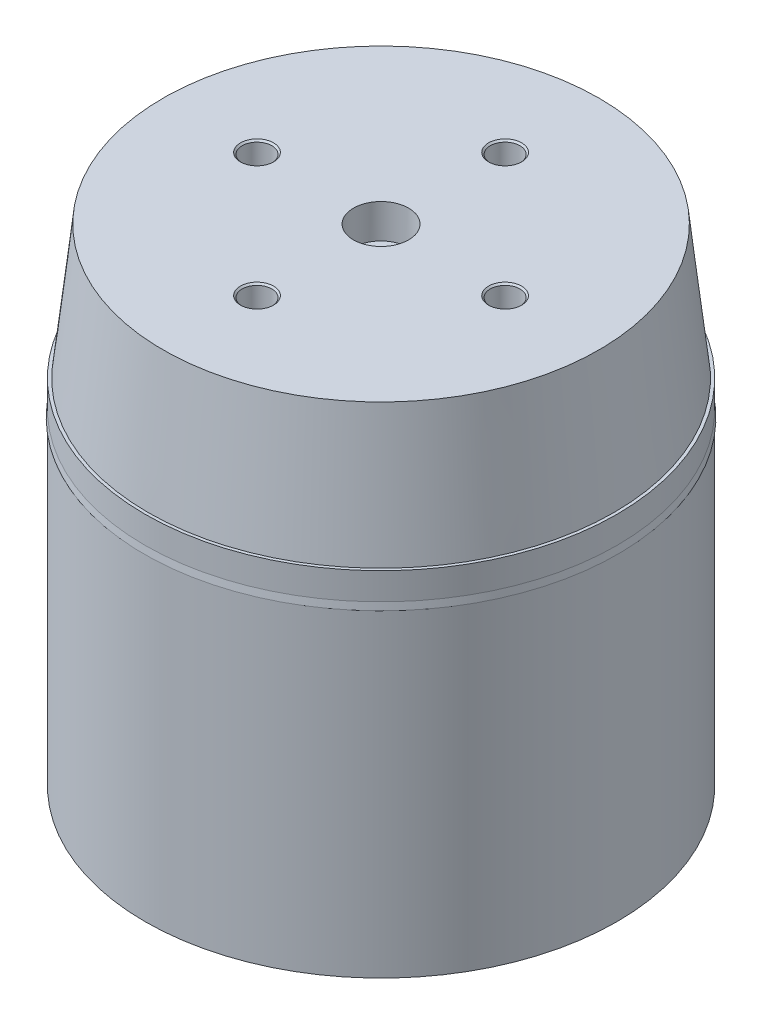
ISO-10303-21;
HEADER;
FILE_DESCRIPTION(('STEP AP214'),'2;1');
FILE_NAME('part.step','',(''),(''),'','','');
FILE_SCHEMA(('AUTOMOTIVE_DESIGN { 1 0 10303 214 1 1 1 1 }'));
ENDSEC;
DATA;
#1=APPLICATION_CONTEXT('core data for automotive mechanical design processes');
#2=APPLICATION_PROTOCOL_DEFINITION('international standard','automotive_design',2000,#1);
#3=PRODUCT_CONTEXT('',#1,'mechanical');
#4=PRODUCT('Part','Part','',(#3));
#5=PRODUCT_RELATED_PRODUCT_CATEGORY('part','',(#4));
#6=PRODUCT_DEFINITION_FORMATION('','',#4);
#7=PRODUCT_DEFINITION_CONTEXT('part definition',#1,'design');
#8=PRODUCT_DEFINITION('design','',#6,#7);
#9=PRODUCT_DEFINITION_SHAPE('','',#8);
#10=(LENGTH_UNIT() NAMED_UNIT(*) SI_UNIT(.MILLI.,.METRE.));
#11=(NAMED_UNIT(*) PLANE_ANGLE_UNIT() SI_UNIT($,.RADIAN.));
#12=(NAMED_UNIT(*) SI_UNIT($,.STERADIAN.) SOLID_ANGLE_UNIT());
#13=UNCERTAINTY_MEASURE_WITH_UNIT(LENGTH_MEASURE(1.E-05),#10,'distance_accuracy_value','');
#14=(GEOMETRIC_REPRESENTATION_CONTEXT(3) GLOBAL_UNCERTAINTY_ASSIGNED_CONTEXT((#13)) GLOBAL_UNIT_ASSIGNED_CONTEXT((#10,
#11,#12)) REPRESENTATION_CONTEXT('',''));
#15=CARTESIAN_POINT('',(0.,0.,0.));
#16=DIRECTION('',(0.,0.,1.));
#17=DIRECTION('',(1.,0.,0.));
#18=AXIS2_PLACEMENT_3D('',#15,#16,#17);
#19=CARTESIAN_POINT('',(0.,32.,0.));
#20=DIRECTION('',(0.,-1.,0.));
#21=DIRECTION('',(0.,0.,-1.));
#22=AXIS2_PLACEMENT_3D('',#19,#20,#21);
#23=CYLINDRICAL_SURFACE('',#22,21.4);
#24=CARTESIAN_POINT('',(0.,0.,0.));
#25=DIRECTION('',(0.,1.,0.));
#26=DIRECTION('',(0.,0.,1.));
#27=AXIS2_PLACEMENT_3D('',#24,#25,#26);
#28=CIRCLE('',#27,21.4);
#29=CARTESIAN_POINT('',(0.,0.,21.4));
#30=VERTEX_POINT('',#29);
#31=EDGE_CURVE('E60',#30,#30,#28,.T.);
#32=ORIENTED_EDGE('',*,*,#31,.T.);
#33=EDGE_LOOP('',(#32));
#34=FACE_BOUND('',#33,.T.);
#35=CARTESIAN_POINT('',(0.,28.9,0.));
#36=DIRECTION('',(0.,1.,0.));
#37=DIRECTION('',(0.,0.,1.));
#38=AXIS2_PLACEMENT_3D('',#35,#36,#37);
#39=CIRCLE('',#38,21.4);
#40=CARTESIAN_POINT('',(0.,28.9,21.4));
#41=VERTEX_POINT('',#40);
#42=EDGE_CURVE('E10',#41,#41,#39,.T.);
#43=ORIENTED_EDGE('',*,*,#42,.F.);
#44=EDGE_LOOP('',(#43));
#45=FACE_BOUND('',#44,.T.);
#46=ADVANCED_FACE('F33',(#34,#45),#23,.T.);
#47=CARTESIAN_POINT('',(0.,32.,0.));
#48=DIRECTION('',(0.,-1.,0.));
#49=DIRECTION('',(0.,0.,-1.));
#50=AXIS2_PLACEMENT_3D('',#47,#48,#49);
#51=CYLINDRICAL_SURFACE('',#50,18.);
#52=CARTESIAN_POINT('',(0.,0.,0.));
#53=DIRECTION('',(0.,1.,0.));
#54=DIRECTION('',(0.,0.,1.));
#55=AXIS2_PLACEMENT_3D('',#52,#53,#54);
#56=CIRCLE('',#55,18.);
#57=CARTESIAN_POINT('',(0.,0.,18.));
#58=VERTEX_POINT('',#57);
#59=EDGE_CURVE('E56',#58,#58,#56,.T.);
#60=ORIENTED_EDGE('',*,*,#59,.F.);
#61=EDGE_LOOP('',(#60));
#62=FACE_BOUND('',#61,.T.);
#63=CARTESIAN_POINT('',(0.,28.9,0.));
#64=DIRECTION('',(0.,1.,0.));
#65=DIRECTION('',(0.,0.,1.));
#66=AXIS2_PLACEMENT_3D('',#63,#64,#65);
#67=CIRCLE('',#66,18.);
#68=CARTESIAN_POINT('',(0.,28.9,18.));
#69=VERTEX_POINT('',#68);
#70=EDGE_CURVE('E57',#69,#69,#67,.T.);
#71=ORIENTED_EDGE('',*,*,#70,.T.);
#72=EDGE_LOOP('',(#71));
#73=FACE_BOUND('',#72,.T.);
#74=ADVANCED_FACE('F180',(#62,#73),#51,.F.);
#75=CARTESIAN_POINT('',(0.,0.,0.));
#76=DIRECTION('',(0.,1.,0.));
#77=DIRECTION('',(0.,0.,1.));
#78=AXIS2_PLACEMENT_3D('',#75,#76,#77);
#79=PLANE('',#78);
#80=ORIENTED_EDGE('',*,*,#31,.F.);
#81=EDGE_LOOP('',(#80));
#82=FACE_BOUND('',#81,.T.);
#83=ORIENTED_EDGE('',*,*,#59,.T.);
#84=EDGE_LOOP('',(#83));
#85=FACE_BOUND('',#84,.T.);
#86=ADVANCED_FACE('F177',(#82,#85),#79,.F.);
#87=CARTESIAN_POINT('',(0.,28.9,0.));
#88=DIRECTION('',(0.,1.,0.));
#89=DIRECTION('',(0.,0.,1.));
#90=AXIS2_PLACEMENT_3D('',#87,#88,#89);
#91=PLANE('',#90);
#92=CARTESIAN_POINT('',(0.,28.9,-11.25));
#93=DIRECTION('',(0.,1.,0.));
#94=DIRECTION('',(0.,0.,1.));
#95=AXIS2_PLACEMENT_3D('',#92,#93,#94);
#96=CIRCLE('',#95,1.35);
#97=CARTESIAN_POINT('',(0.,28.9,-9.9));
#98=VERTEX_POINT('',#97);
#99=EDGE_CURVE('E97',#98,#98,#96,.T.);
#100=ORIENTED_EDGE('',*,*,#99,.T.);
#101=EDGE_LOOP('',(#100));
#102=FACE_BOUND('',#101,.T.);
#103=CARTESIAN_POINT('',(11.2500000000003,28.9,-3.18366503443004E-13));
#104=DIRECTION('',(0.,1.,0.));
#105=DIRECTION('',(0.,0.,1.));
#106=AXIS2_PLACEMENT_3D('',#103,#104,#105);
#107=CIRCLE('',#106,1.35);
#108=CARTESIAN_POINT('',(11.2500000000003,28.9,1.34999999999968));
#109=VERTEX_POINT('',#108);
#110=EDGE_CURVE('E89',#109,#109,#107,.T.);
#111=ORIENTED_EDGE('',*,*,#110,.T.);
#112=EDGE_LOOP('',(#111));
#113=FACE_BOUND('',#112,.T.);
#114=CARTESIAN_POINT('',(6.36733006886009E-13,28.9,11.25));
#115=DIRECTION('',(0.,1.,0.));
#116=DIRECTION('',(0.,0.,1.));
#117=AXIS2_PLACEMENT_3D('',#114,#115,#116);
#118=CIRCLE('',#117,1.35);
#119=CARTESIAN_POINT('',(6.36733006886009E-13,28.9,12.6));
#120=VERTEX_POINT('',#119);
#121=EDGE_CURVE('E110',#120,#120,#118,.T.);
#122=ORIENTED_EDGE('',*,*,#121,.T.);
#123=EDGE_LOOP('',(#122));
#124=FACE_BOUND('',#123,.T.);
#125=CARTESIAN_POINT('',(-11.2499999999997,28.9,3.19744231092045E-13));
#126=DIRECTION('',(0.,1.,0.));
#127=DIRECTION('',(0.,0.,1.));
#128=AXIS2_PLACEMENT_3D('',#125,#126,#127);
#129=CIRCLE('',#128,1.35);
#130=CARTESIAN_POINT('',(-11.2499999999997,28.9,1.35000000000032));
#131=VERTEX_POINT('',#130);
#132=EDGE_CURVE('E120',#131,#131,#129,.T.);
#133=ORIENTED_EDGE('',*,*,#132,.T.);
#134=EDGE_LOOP('',(#133));
#135=FACE_BOUND('',#134,.T.);
#136=CARTESIAN_POINT('',(0.,28.9,0.));
#137=DIRECTION('',(0.,1.,0.));
#138=DIRECTION('',(0.,0.,1.));
#139=AXIS2_PLACEMENT_3D('',#136,#137,#138);
#140=CIRCLE('',#139,2.5);
#141=CARTESIAN_POINT('',(0.,28.9,2.5));
#142=VERTEX_POINT('',#141);
#143=EDGE_CURVE('E127',#142,#142,#140,.T.);
#144=ORIENTED_EDGE('',*,*,#143,.T.);
#145=EDGE_LOOP('',(#144));
#146=FACE_BOUND('',#145,.T.);
#147=ORIENTED_EDGE('',*,*,#70,.F.);
#148=EDGE_LOOP('',(#147));
#149=FACE_BOUND('',#148,.T.);
#150=ADVANCED_FACE('F174',(#102,#113,#124,#135,#146,#149),#91,.F.);
#151=CARTESIAN_POINT('',(0.,44.1,0.));
#152=DIRECTION('',(0.,-1.,0.));
#153=DIRECTION('',(0.,0.,-1.));
#154=AXIS2_PLACEMENT_3D('',#151,#152,#153);
#155=CONICAL_SURFACE('',#154,19.7724942894243,0.111423455615255);
#156=CARTESIAN_POINT('',(0.,28.9,0.));
#157=DIRECTION('',(0.,-1.,0.));
#158=DIRECTION('',(0.,0.,-1.));
#159=AXIS2_PLACEMENT_3D('',#156,#157,#158);
#160=CIRCLE('',#159,21.473174735233);
#161=CARTESIAN_POINT('',(0.,28.9,-21.473174735233));
#162=VERTEX_POINT('',#161);
#163=EDGE_CURVE('E66',#162,#162,#160,.T.);
#164=ORIENTED_EDGE('',*,*,#163,.F.);
#165=EDGE_LOOP('',(#164));
#166=FACE_BOUND('',#165,.T.);
#167=CARTESIAN_POINT('',(0.,29.5540064468209,0.));
#168=DIRECTION('',(0.,-1.,0.));
#169=DIRECTION('',(0.,0.,-1.));
#170=AXIS2_PLACEMENT_3D('',#167,#168,#169);
#171=CIRCLE('',#170,21.4);
#172=CARTESIAN_POINT('',(0.,29.5540064468209,-21.4));
#173=VERTEX_POINT('',#172);
#174=EDGE_CURVE('E40',#173,#173,#171,.T.);
#175=ORIENTED_EDGE('',*,*,#174,.T.);
#176=EDGE_LOOP('',(#175));
#177=FACE_BOUND('',#176,.T.);
#178=ADVANCED_FACE('F173',(#166,#177),#155,.T.);
#179=ORIENTED_EDGE('',*,*,#163,.T.);
#180=EDGE_LOOP('',(#179));
#181=FACE_BOUND('',#180,.T.);
#182=ORIENTED_EDGE('',*,*,#42,.T.);
#183=EDGE_LOOP('',(#182));
#184=FACE_BOUND('',#183,.T.);
#185=ADVANCED_FACE('F179',(#181,#184),#91,.F.);
#186=CARTESIAN_POINT('',(0.,32.,0.));
#187=DIRECTION('',(0.,1.,0.));
#188=DIRECTION('',(0.,0.,1.));
#189=AXIS2_PLACEMENT_3D('',#186,#187,#188);
#190=CIRCLE('',#189,21.4);
#191=CARTESIAN_POINT('',(0.,32.,21.4));
#192=VERTEX_POINT('',#191);
#193=EDGE_CURVE('E45',#192,#192,#190,.T.);
#194=ORIENTED_EDGE('',*,*,#193,.F.);
#195=EDGE_LOOP('',(#194));
#196=FACE_BOUND('',#195,.T.);
#197=ORIENTED_EDGE('',*,*,#174,.F.);
#198=EDGE_LOOP('',(#197));
#199=FACE_BOUND('',#198,.T.);
#200=ADVANCED_FACE('F185',(#196,#199),#23,.T.);
#201=CARTESIAN_POINT('',(0.,32.,0.));
#202=DIRECTION('',(0.,1.,0.));
#203=DIRECTION('',(0.,0.,1.));
#204=AXIS2_PLACEMENT_3D('',#201,#202,#203);
#205=PLANE('',#204);
#206=ORIENTED_EDGE('',*,*,#193,.T.);
#207=EDGE_LOOP('',(#206));
#208=FACE_BOUND('',#207,.T.);
#209=CARTESIAN_POINT('',(0.,32.,0.));
#210=DIRECTION('',(0.,1.,0.));
#211=DIRECTION('',(0.,0.,1.));
#212=AXIS2_PLACEMENT_3D('',#209,#210,#211);
#213=CIRCLE('',#212,21.1263254337851);
#214=CARTESIAN_POINT('',(0.,32.,21.1263254337851));
#215=VERTEX_POINT('',#214);
#216=EDGE_CURVE('E53',#215,#215,#213,.F.);
#217=ORIENTED_EDGE('',*,*,#216,.T.);
#218=EDGE_LOOP('',(#217));
#219=FACE_BOUND('',#218,.T.);
#220=ADVANCED_FACE('F171',(#208,#219),#205,.T.);
#221=ORIENTED_EDGE('',*,*,#216,.F.);
#222=EDGE_LOOP('',(#221));
#223=FACE_BOUND('',#222,.T.);
#224=CARTESIAN_POINT('',(0.,44.1,0.));
#225=DIRECTION('',(0.,-1.,0.));
#226=DIRECTION('',(0.,0.,-1.));
#227=AXIS2_PLACEMENT_3D('',#224,#225,#226);
#228=CIRCLE('',#227,19.7724942894243);
#229=CARTESIAN_POINT('',(0.,44.1,-19.7724942894243));
#230=VERTEX_POINT('',#229);
#231=EDGE_CURVE('E134',#230,#230,#228,.T.);
#232=ORIENTED_EDGE('',*,*,#231,.T.);
#233=EDGE_LOOP('',(#232));
#234=FACE_BOUND('',#233,.T.);
#235=ADVANCED_FACE('F167',(#223,#234),#155,.T.);
#236=CARTESIAN_POINT('',(0.,44.1,0.));
#237=DIRECTION('',(0.,-1.,0.));
#238=DIRECTION('',(0.,0.,-1.));
#239=AXIS2_PLACEMENT_3D('',#236,#237,#238);
#240=PLANE('',#239);
#241=CARTESIAN_POINT('',(0.,44.1,-11.25));
#242=DIRECTION('',(0.,1.,0.));
#243=DIRECTION('',(0.,0.,1.));
#244=AXIS2_PLACEMENT_3D('',#241,#242,#243);
#245=CIRCLE('',#244,1.5);
#246=CARTESIAN_POINT('',(0.,44.1,-9.75));
#247=VERTEX_POINT('',#246);
#248=EDGE_CURVE('E409',#247,#247,#245,.T.);
#249=ORIENTED_EDGE('',*,*,#248,.F.);
#250=EDGE_LOOP('',(#249));
#251=FACE_BOUND('',#250,.T.);
#252=CARTESIAN_POINT('',(11.2500000000003,44.1,-3.18366503443004E-13));
#253=DIRECTION('',(0.,1.,0.));
#254=DIRECTION('',(0.,0.,1.));
#255=AXIS2_PLACEMENT_3D('',#252,#253,#254);
#256=CIRCLE('',#255,1.5);
#257=CARTESIAN_POINT('',(11.2500000000003,44.1,1.49999999999968));
#258=VERTEX_POINT('',#257);
#259=EDGE_CURVE('E92',#258,#258,#256,.T.);
#260=ORIENTED_EDGE('',*,*,#259,.F.);
#261=EDGE_LOOP('',(#260));
#262=FACE_BOUND('',#261,.T.);
#263=CARTESIAN_POINT('',(6.36733006886009E-13,44.1,11.25));
#264=DIRECTION('',(0.,1.,0.));
#265=DIRECTION('',(0.,0.,1.));
#266=AXIS2_PLACEMENT_3D('',#263,#264,#265);
#267=CIRCLE('',#266,1.5);
#268=CARTESIAN_POINT('',(6.36733006886009E-13,44.1,12.75));
#269=VERTEX_POINT('',#268);
#270=EDGE_CURVE('E103',#269,#269,#267,.T.);
#271=ORIENTED_EDGE('',*,*,#270,.F.);
#272=EDGE_LOOP('',(#271));
#273=FACE_BOUND('',#272,.T.);
#274=CARTESIAN_POINT('',(-11.2499999999997,44.1,3.19744231092045E-13));
#275=DIRECTION('',(0.,1.,0.));
#276=DIRECTION('',(0.,0.,1.));
#277=AXIS2_PLACEMENT_3D('',#274,#275,#276);
#278=CIRCLE('',#277,1.5);
#279=CARTESIAN_POINT('',(-11.2499999999997,44.1,1.50000000000032));
#280=VERTEX_POINT('',#279);
#281=EDGE_CURVE('E113',#280,#280,#278,.T.);
#282=ORIENTED_EDGE('',*,*,#281,.F.);
#283=EDGE_LOOP('',(#282));
#284=FACE_BOUND('',#283,.T.);
#285=CARTESIAN_POINT('',(0.,44.1,0.));
#286=DIRECTION('',(0.,1.,0.));
#287=DIRECTION('',(0.,0.,1.));
#288=AXIS2_PLACEMENT_3D('',#285,#286,#287);
#289=CIRCLE('',#288,2.5);
#290=CARTESIAN_POINT('',(0.,44.1,2.5));
#291=VERTEX_POINT('',#290);
#292=EDGE_CURVE('E72',#291,#291,#289,.T.);
#293=ORIENTED_EDGE('',*,*,#292,.F.);
#294=EDGE_LOOP('',(#293));
#295=FACE_BOUND('',#294,.T.);
#296=ORIENTED_EDGE('',*,*,#231,.F.);
#297=EDGE_LOOP('',(#296));
#298=FACE_BOUND('',#297,.T.);
#299=ADVANCED_FACE('F163',(#251,#262,#273,#284,#295,#298),#240,.F.);
#300=CARTESIAN_POINT('',(0.,0.,0.));
#301=DIRECTION('',(0.,1.,0.));
#302=DIRECTION('',(0.,0.,1.));
#303=AXIS2_PLACEMENT_3D('',#300,#301,#302);
#304=CYLINDRICAL_SURFACE('',#303,2.5);
#305=CARTESIAN_POINT('',(0.,32.,0.));
#306=DIRECTION('',(0.,1.,0.));
#307=DIRECTION('',(0.,0.,1.));
#308=AXIS2_PLACEMENT_3D('',#305,#306,#307);
#309=CIRCLE('',#308,2.5);
#310=CARTESIAN_POINT('',(0.,32.,2.5));
#311=VERTEX_POINT('',#310);
#312=EDGE_CURVE('E68',#311,#311,#309,.T.);
#313=ORIENTED_EDGE('',*,*,#312,.T.);
#314=EDGE_LOOP('',(#313));
#315=FACE_BOUND('',#314,.T.);
#316=ORIENTED_EDGE('',*,*,#143,.F.);
#317=EDGE_LOOP('',(#316));
#318=FACE_BOUND('',#317,.T.);
#319=ADVANCED_FACE('F166',(#315,#318),#304,.F.);
#320=CARTESIAN_POINT('',(0.,41.,0.));
#321=DIRECTION('',(0.,-1.,0.));
#322=DIRECTION('',(0.,0.,-1.));
#323=AXIS2_PLACEMENT_3D('',#320,#321,#322);
#324=CIRCLE('',#323,2.5);
#325=CARTESIAN_POINT('',(0.,41.,-2.5));
#326=VERTEX_POINT('',#325);
#327=EDGE_CURVE('E71',#326,#326,#324,.T.);
#328=ORIENTED_EDGE('',*,*,#327,.T.);
#329=EDGE_LOOP('',(#328));
#330=FACE_BOUND('',#329,.T.);
#331=ORIENTED_EDGE('',*,*,#292,.T.);
#332=EDGE_LOOP('',(#331));
#333=FACE_BOUND('',#332,.T.);
#334=ADVANCED_FACE('F161',(#330,#333),#304,.F.);
#335=CARTESIAN_POINT('',(0.,41.,0.));
#336=DIRECTION('',(0.,-1.,0.));
#337=DIRECTION('',(0.,0.,-1.));
#338=AXIS2_PLACEMENT_3D('',#335,#336,#337);
#339=PLANE('',#338);
#340=CARTESIAN_POINT('',(0.,41.,-11.25));
#341=DIRECTION('',(0.,-1.,0.));
#342=DIRECTION('',(0.,0.,-1.));
#343=AXIS2_PLACEMENT_3D('',#340,#341,#342);
#344=CIRCLE('',#343,1.35);
#345=CARTESIAN_POINT('',(0.,41.,-12.6));
#346=VERTEX_POINT('',#345);
#347=EDGE_CURVE('E413',#346,#346,#344,.T.);
#348=ORIENTED_EDGE('',*,*,#347,.F.);
#349=EDGE_LOOP('',(#348));
#350=FACE_BOUND('',#349,.T.);
#351=CARTESIAN_POINT('',(11.2500000000003,41.,-3.18366503443004E-13));
#352=DIRECTION('',(0.,-1.,0.));
#353=DIRECTION('',(0.,0.,-1.));
#354=AXIS2_PLACEMENT_3D('',#351,#352,#353);
#355=CIRCLE('',#354,1.35);
#356=CARTESIAN_POINT('',(11.2500000000003,41.,-1.35000000000031));
#357=VERTEX_POINT('',#356);
#358=EDGE_CURVE('E84',#357,#357,#355,.T.);
#359=ORIENTED_EDGE('',*,*,#358,.F.);
#360=EDGE_LOOP('',(#359));
#361=FACE_BOUND('',#360,.T.);
#362=CARTESIAN_POINT('',(6.36733006886009E-13,41.,11.25));
#363=DIRECTION('',(0.,-1.,0.));
#364=DIRECTION('',(0.,0.,-1.));
#365=AXIS2_PLACEMENT_3D('',#362,#363,#364);
#366=CIRCLE('',#365,1.35);
#367=CARTESIAN_POINT('',(6.36733006886009E-13,41.,9.9));
#368=VERTEX_POINT('',#367);
#369=EDGE_CURVE('E80',#368,#368,#366,.T.);
#370=ORIENTED_EDGE('',*,*,#369,.F.);
#371=EDGE_LOOP('',(#370));
#372=FACE_BOUND('',#371,.T.);
#373=CARTESIAN_POINT('',(-11.2499999999997,41.,3.19744231092045E-13));
#374=DIRECTION('',(0.,-1.,0.));
#375=DIRECTION('',(0.,0.,-1.));
#376=AXIS2_PLACEMENT_3D('',#373,#374,#375);
#377=CIRCLE('',#376,1.35);
#378=CARTESIAN_POINT('',(-11.2499999999997,41.,-1.34999999999968));
#379=VERTEX_POINT('',#378);
#380=EDGE_CURVE('E76',#379,#379,#377,.T.);
#381=ORIENTED_EDGE('',*,*,#380,.F.);
#382=EDGE_LOOP('',(#381));
#383=FACE_BOUND('',#382,.T.);
#384=ORIENTED_EDGE('',*,*,#327,.F.);
#385=EDGE_LOOP('',(#384));
#386=FACE_BOUND('',#385,.T.);
#387=CARTESIAN_POINT('',(0.,41.,0.));
#388=DIRECTION('',(0.,-1.,0.));
#389=DIRECTION('',(0.,0.,-1.));
#390=AXIS2_PLACEMENT_3D('',#387,#388,#389);
#391=CIRCLE('',#390,17.);
#392=CARTESIAN_POINT('',(0.,41.,-17.));
#393=VERTEX_POINT('',#392);
#394=EDGE_CURVE('E131',#393,#393,#391,.T.);
#395=ORIENTED_EDGE('',*,*,#394,.T.);
#396=EDGE_LOOP('',(#395));
#397=FACE_BOUND('',#396,.T.);
#398=ADVANCED_FACE('F156',(#350,#361,#372,#383,#386,#397),#339,.T.);
#399=CARTESIAN_POINT('',(0.,41.,0.));
#400=DIRECTION('',(0.,-1.,0.));
#401=DIRECTION('',(0.,0.,-1.));
#402=AXIS2_PLACEMENT_3D('',#399,#400,#401);
#403=CONICAL_SURFACE('',#402,17.,0.111423455615255);
#404=CARTESIAN_POINT('',(0.,32.,0.));
#405=DIRECTION('',(0.,-1.,0.));
#406=DIRECTION('',(0.,0.,-1.));
#407=AXIS2_PLACEMENT_3D('',#404,#405,#406);
#408=CIRCLE('',#407,18.006981842913);
#409=CARTESIAN_POINT('',(0.,32.,-18.006981842913));
#410=VERTEX_POINT('',#409);
#411=EDGE_CURVE('E130',#410,#410,#408,.T.);
#412=ORIENTED_EDGE('',*,*,#411,.T.);
#413=EDGE_LOOP('',(#412));
#414=FACE_BOUND('',#413,.T.);
#415=ORIENTED_EDGE('',*,*,#394,.F.);
#416=EDGE_LOOP('',(#415));
#417=FACE_BOUND('',#416,.T.);
#418=ADVANCED_FACE('F146',(#414,#417),#403,.F.);
#419=CARTESIAN_POINT('',(0.,32.,0.));
#420=DIRECTION('',(0.,1.,0.));
#421=DIRECTION('',(0.,0.,1.));
#422=AXIS2_PLACEMENT_3D('',#419,#420,#421);
#423=PLANE('',#422);
#424=CARTESIAN_POINT('',(0.,32.,-11.25));
#425=DIRECTION('',(0.,1.,0.));
#426=DIRECTION('',(0.,0.,1.));
#427=AXIS2_PLACEMENT_3D('',#424,#425,#426);
#428=CIRCLE('',#427,1.35);
#429=CARTESIAN_POINT('',(0.,32.,-9.9));
#430=VERTEX_POINT('',#429);
#431=EDGE_CURVE('E36',#430,#430,#428,.T.);
#432=ORIENTED_EDGE('',*,*,#431,.F.);
#433=EDGE_LOOP('',(#432));
#434=FACE_BOUND('',#433,.T.);
#435=CARTESIAN_POINT('',(11.2500000000003,32.,-3.18366503443004E-13));
#436=DIRECTION('',(0.,1.,0.));
#437=DIRECTION('',(0.,0.,1.));
#438=AXIS2_PLACEMENT_3D('',#435,#436,#437);
#439=CIRCLE('',#438,1.35);
#440=CARTESIAN_POINT('',(11.2500000000003,32.,1.34999999999968));
#441=VERTEX_POINT('',#440);
#442=EDGE_CURVE('E82',#441,#441,#439,.T.);
#443=ORIENTED_EDGE('',*,*,#442,.F.);
#444=EDGE_LOOP('',(#443));
#445=FACE_BOUND('',#444,.T.);
#446=CARTESIAN_POINT('',(6.36733006886009E-13,32.,11.25));
#447=DIRECTION('',(0.,1.,0.));
#448=DIRECTION('',(0.,0.,1.));
#449=AXIS2_PLACEMENT_3D('',#446,#447,#448);
#450=CIRCLE('',#449,1.35);
#451=CARTESIAN_POINT('',(6.36733006886009E-13,32.,12.6));
#452=VERTEX_POINT('',#451);
#453=EDGE_CURVE('E78',#452,#452,#450,.T.);
#454=ORIENTED_EDGE('',*,*,#453,.F.);
#455=EDGE_LOOP('',(#454));
#456=FACE_BOUND('',#455,.T.);
#457=CARTESIAN_POINT('',(-11.2499999999997,32.,3.19744231092045E-13));
#458=DIRECTION('',(0.,1.,0.));
#459=DIRECTION('',(0.,0.,1.));
#460=AXIS2_PLACEMENT_3D('',#457,#458,#459);
#461=CIRCLE('',#460,1.35);
#462=CARTESIAN_POINT('',(-11.2499999999997,32.,1.35000000000032));
#463=VERTEX_POINT('',#462);
#464=EDGE_CURVE('E73',#463,#463,#461,.T.);
#465=ORIENTED_EDGE('',*,*,#464,.F.);
#466=EDGE_LOOP('',(#465));
#467=FACE_BOUND('',#466,.T.);
#468=ORIENTED_EDGE('',*,*,#312,.F.);
#469=EDGE_LOOP('',(#468));
#470=FACE_BOUND('',#469,.T.);
#471=ORIENTED_EDGE('',*,*,#411,.F.);
#472=EDGE_LOOP('',(#471));
#473=FACE_BOUND('',#472,.T.);
#474=ADVANCED_FACE('F155',(#434,#445,#456,#467,#470,#473),#423,.T.);
#475=CARTESIAN_POINT('',(-11.2499999999997,44.1,3.19744231092045E-13));
#476=DIRECTION('',(0.,1.,0.));
#477=DIRECTION('',(0.,0.,1.));
#478=AXIS2_PLACEMENT_3D('',#475,#476,#477);
#479=CYLINDRICAL_SURFACE('',#478,1.35);
#480=ORIENTED_EDGE('',*,*,#464,.T.);
#481=EDGE_LOOP('',(#480));
#482=FACE_BOUND('',#481,.T.);
#483=ORIENTED_EDGE('',*,*,#132,.F.);
#484=EDGE_LOOP('',(#483));
#485=FACE_BOUND('',#484,.T.);
#486=ADVANCED_FACE('F286',(#482,#485),#479,.F.);
#487=ORIENTED_EDGE('',*,*,#380,.T.);
#488=EDGE_LOOP('',(#487));
#489=FACE_BOUND('',#488,.T.);
#490=CARTESIAN_POINT('',(-11.2499999999997,43.95,3.19744231092045E-13));
#491=DIRECTION('',(0.,1.,0.));
#492=DIRECTION('',(0.,0.,1.));
#493=AXIS2_PLACEMENT_3D('',#490,#491,#492);
#494=CIRCLE('',#493,1.35);
#495=CARTESIAN_POINT('',(-11.2499999999997,43.95,1.35000000000032));
#496=VERTEX_POINT('',#495);
#497=EDGE_CURVE('E77',#496,#496,#494,.T.);
#498=ORIENTED_EDGE('',*,*,#497,.T.);
#499=EDGE_LOOP('',(#498));
#500=FACE_BOUND('',#499,.T.);
#501=ADVANCED_FACE('F294',(#489,#500),#479,.F.);
#502=CARTESIAN_POINT('',(-11.2499999999997,44.1,3.19744231092045E-13));
#503=DIRECTION('',(0.,1.,0.));
#504=DIRECTION('',(0.,0.,1.));
#505=AXIS2_PLACEMENT_3D('',#502,#503,#504);
#506=CONICAL_SURFACE('',#505,1.5,0.78539816339746);
#507=ORIENTED_EDGE('',*,*,#497,.F.);
#508=EDGE_LOOP('',(#507));
#509=FACE_BOUND('',#508,.T.);
#510=ORIENTED_EDGE('',*,*,#281,.T.);
#511=EDGE_LOOP('',(#510));
#512=FACE_BOUND('',#511,.T.);
#513=ADVANCED_FACE('F304',(#509,#512),#506,.F.);
#514=CARTESIAN_POINT('',(6.36733006886009E-13,44.1,11.25));
#515=DIRECTION('',(0.,1.,0.));
#516=DIRECTION('',(0.,0.,1.));
#517=AXIS2_PLACEMENT_3D('',#514,#515,#516);
#518=CYLINDRICAL_SURFACE('',#517,1.35);
#519=ORIENTED_EDGE('',*,*,#453,.T.);
#520=EDGE_LOOP('',(#519));
#521=FACE_BOUND('',#520,.T.);
#522=ORIENTED_EDGE('',*,*,#121,.F.);
#523=EDGE_LOOP('',(#522));
#524=FACE_BOUND('',#523,.T.);
#525=ADVANCED_FACE('F313',(#521,#524),#518,.F.);
#526=ORIENTED_EDGE('',*,*,#369,.T.);
#527=EDGE_LOOP('',(#526));
#528=FACE_BOUND('',#527,.T.);
#529=CARTESIAN_POINT('',(6.36733006886009E-13,43.95,11.25));
#530=DIRECTION('',(0.,1.,0.));
#531=DIRECTION('',(0.,0.,1.));
#532=AXIS2_PLACEMENT_3D('',#529,#530,#531);
#533=CIRCLE('',#532,1.35);
#534=CARTESIAN_POINT('',(6.36733006886009E-13,43.95,12.6));
#535=VERTEX_POINT('',#534);
#536=EDGE_CURVE('E81',#535,#535,#533,.T.);
#537=ORIENTED_EDGE('',*,*,#536,.T.);
#538=EDGE_LOOP('',(#537));
#539=FACE_BOUND('',#538,.T.);
#540=ADVANCED_FACE('F323',(#528,#539),#518,.F.);
#541=CARTESIAN_POINT('',(6.36733006886009E-13,44.1,11.25));
#542=DIRECTION('',(0.,1.,0.));
#543=DIRECTION('',(0.,0.,1.));
#544=AXIS2_PLACEMENT_3D('',#541,#542,#543);
#545=CONICAL_SURFACE('',#544,1.5,0.785398163397461);
#546=ORIENTED_EDGE('',*,*,#536,.F.);
#547=EDGE_LOOP('',(#546));
#548=FACE_BOUND('',#547,.T.);
#549=ORIENTED_EDGE('',*,*,#270,.T.);
#550=EDGE_LOOP('',(#549));
#551=FACE_BOUND('',#550,.T.);
#552=ADVANCED_FACE('F333',(#548,#551),#545,.F.);
#553=CARTESIAN_POINT('',(11.2500000000003,44.1,-3.18366503443004E-13));
#554=DIRECTION('',(0.,1.,0.));
#555=DIRECTION('',(0.,0.,1.));
#556=AXIS2_PLACEMENT_3D('',#553,#554,#555);
#557=CYLINDRICAL_SURFACE('',#556,1.35);
#558=ORIENTED_EDGE('',*,*,#442,.T.);
#559=EDGE_LOOP('',(#558));
#560=FACE_BOUND('',#559,.T.);
#561=ORIENTED_EDGE('',*,*,#110,.F.);
#562=EDGE_LOOP('',(#561));
#563=FACE_BOUND('',#562,.T.);
#564=ADVANCED_FACE('F342',(#560,#563),#557,.F.);
#565=ORIENTED_EDGE('',*,*,#358,.T.);
#566=EDGE_LOOP('',(#565));
#567=FACE_BOUND('',#566,.T.);
#568=CARTESIAN_POINT('',(11.2500000000003,43.95,-3.18366503443004E-13));
#569=DIRECTION('',(0.,1.,0.));
#570=DIRECTION('',(0.,0.,1.));
#571=AXIS2_PLACEMENT_3D('',#568,#569,#570);
#572=CIRCLE('',#571,1.35);
#573=CARTESIAN_POINT('',(11.2500000000003,43.95,1.34999999999968));
#574=VERTEX_POINT('',#573);
#575=EDGE_CURVE('E85',#574,#574,#572,.T.);
#576=ORIENTED_EDGE('',*,*,#575,.T.);
#577=EDGE_LOOP('',(#576));
#578=FACE_BOUND('',#577,.T.);
#579=ADVANCED_FACE('F352',(#567,#578),#557,.F.);
#580=CARTESIAN_POINT('',(11.2500000000003,44.1,-3.18366503443004E-13));
#581=DIRECTION('',(0.,1.,0.));
#582=DIRECTION('',(0.,0.,1.));
#583=AXIS2_PLACEMENT_3D('',#580,#581,#582);
#584=CONICAL_SURFACE('',#583,1.5,0.78539816339746);
#585=ORIENTED_EDGE('',*,*,#575,.F.);
#586=EDGE_LOOP('',(#585));
#587=FACE_BOUND('',#586,.T.);
#588=ORIENTED_EDGE('',*,*,#259,.T.);
#589=EDGE_LOOP('',(#588));
#590=FACE_BOUND('',#589,.T.);
#591=ADVANCED_FACE('F361',(#587,#590),#584,.F.);
#592=CARTESIAN_POINT('',(0.,44.1,-11.25));
#593=DIRECTION('',(0.,1.,0.));
#594=DIRECTION('',(0.,0.,1.));
#595=AXIS2_PLACEMENT_3D('',#592,#593,#594);
#596=CYLINDRICAL_SURFACE('',#595,1.35);
#597=ORIENTED_EDGE('',*,*,#431,.T.);
#598=EDGE_LOOP('',(#597));
#599=FACE_BOUND('',#598,.T.);
#600=ORIENTED_EDGE('',*,*,#99,.F.);
#601=EDGE_LOOP('',(#600));
#602=FACE_BOUND('',#601,.T.);
#603=ADVANCED_FACE('F370',(#599,#602),#596,.F.);
#604=ORIENTED_EDGE('',*,*,#347,.T.);
#605=EDGE_LOOP('',(#604));
#606=FACE_BOUND('',#605,.T.);
#607=CARTESIAN_POINT('',(0.,43.95,-11.25));
#608=DIRECTION('',(0.,1.,0.));
#609=DIRECTION('',(0.,0.,1.));
#610=AXIS2_PLACEMENT_3D('',#607,#608,#609);
#611=CIRCLE('',#610,1.35);
#612=CARTESIAN_POINT('',(0.,43.95,-9.9));
#613=VERTEX_POINT('',#612);
#614=EDGE_CURVE('E406',#613,#613,#611,.T.);
#615=ORIENTED_EDGE('',*,*,#614,.T.);
#616=EDGE_LOOP('',(#615));
#617=FACE_BOUND('',#616,.T.);
#618=ADVANCED_FACE('F380',(#606,#617),#596,.F.);
#619=CARTESIAN_POINT('',(0.,44.1,-11.25));
#620=DIRECTION('',(0.,1.,0.));
#621=DIRECTION('',(0.,0.,1.));
#622=AXIS2_PLACEMENT_3D('',#619,#620,#621);
#623=CONICAL_SURFACE('',#622,1.5,0.785398163397461);
#624=ORIENTED_EDGE('',*,*,#614,.F.);
#625=EDGE_LOOP('',(#624));
#626=FACE_BOUND('',#625,.T.);
#627=ORIENTED_EDGE('',*,*,#248,.T.);
#628=EDGE_LOOP('',(#627));
#629=FACE_BOUND('',#628,.T.);
#630=ADVANCED_FACE('F390',(#626,#629),#623,.F.);
#631=CLOSED_SHELL('',(#46,#74,#86,#150,#178,#185,#200,#220,#235,#299,#319,#334,#398,#418,#474,
#486,#501,#513,#525,#540,#552,#564,#579,#591,#603,#618,#630));
#632=MANIFOLD_SOLID_BREP('B2',#631);
#633=ADVANCED_BREP_SHAPE_REPRESENTATION('',(#18,#632),#14);
#634=SHAPE_DEFINITION_REPRESENTATION(#9,#633);
ENDSEC;
END-ISO-10303-21;
